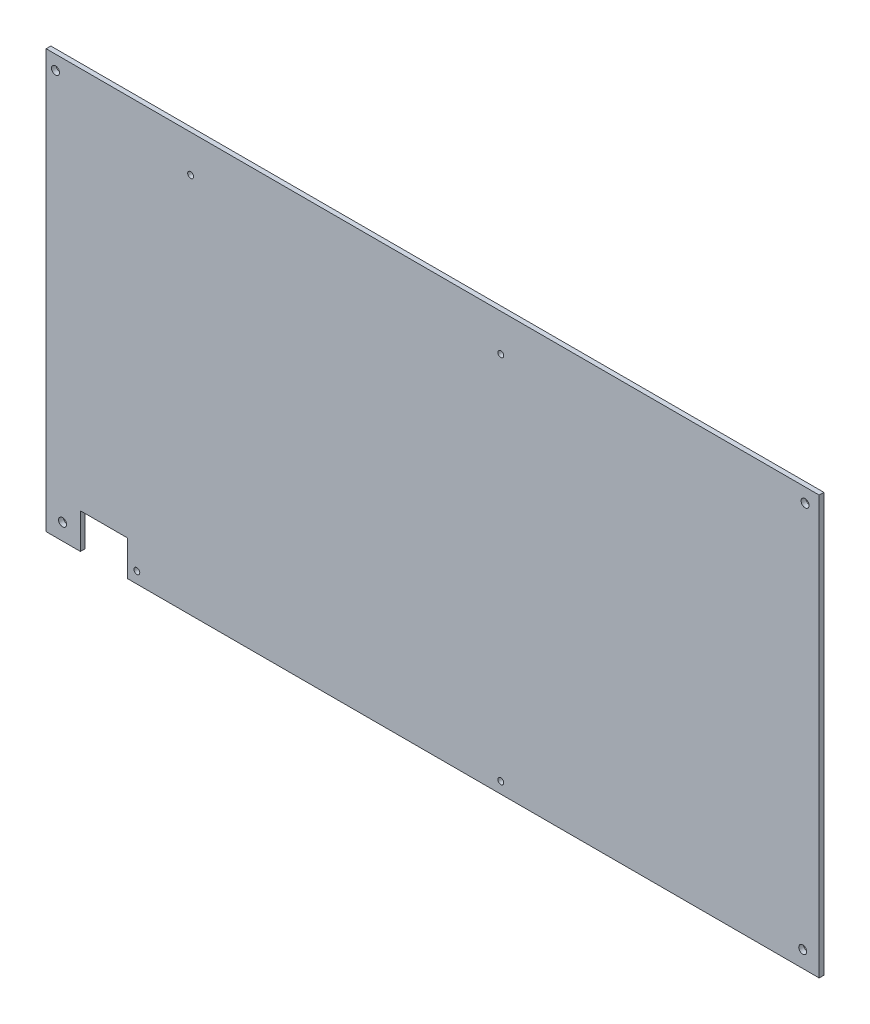
ISO-10303-21;
HEADER;
FILE_DESCRIPTION(('STEP AP214'),'2;1');
FILE_NAME('part.step','',(''),(''),'','','');
FILE_SCHEMA(('AUTOMOTIVE_DESIGN { 1 0 10303 214 1 1 1 1 }'));
ENDSEC;
DATA;
#1=APPLICATION_CONTEXT('core data for automotive mechanical design processes');
#2=APPLICATION_PROTOCOL_DEFINITION('international standard','automotive_design',2000,#1);
#3=PRODUCT_CONTEXT('',#1,'mechanical');
#4=PRODUCT('Part','Part','',(#3));
#5=PRODUCT_RELATED_PRODUCT_CATEGORY('part','',(#4));
#6=PRODUCT_DEFINITION_FORMATION('','',#4);
#7=PRODUCT_DEFINITION_CONTEXT('part definition',#1,'design');
#8=PRODUCT_DEFINITION('design','',#6,#7);
#9=PRODUCT_DEFINITION_SHAPE('','',#8);
#10=(LENGTH_UNIT() NAMED_UNIT(*) SI_UNIT(.MILLI.,.METRE.));
#11=(NAMED_UNIT(*) PLANE_ANGLE_UNIT() SI_UNIT($,.RADIAN.));
#12=(NAMED_UNIT(*) SI_UNIT($,.STERADIAN.) SOLID_ANGLE_UNIT());
#13=UNCERTAINTY_MEASURE_WITH_UNIT(LENGTH_MEASURE(1.E-05),#10,'distance_accuracy_value','');
#14=(GEOMETRIC_REPRESENTATION_CONTEXT(3) GLOBAL_UNCERTAINTY_ASSIGNED_CONTEXT((#13)) GLOBAL_UNIT_ASSIGNED_CONTEXT((#10,
#11,#12)) REPRESENTATION_CONTEXT('',''));
#15=CARTESIAN_POINT('',(0.,0.,0.));
#16=DIRECTION('',(0.,0.,1.));
#17=DIRECTION('',(1.,0.,0.));
#18=AXIS2_PLACEMENT_3D('',#15,#16,#17);
#19=CARTESIAN_POINT('',(0.,0.,-2.));
#20=DIRECTION('',(0.,-1.,0.));
#21=DIRECTION('',(0.,0.,-1.));
#22=AXIS2_PLACEMENT_3D('',#19,#20,#21);
#23=PLANE('',#22);
#24=DIRECTION('',(0.,0.,1.));
#25=VECTOR('',#24,1.);
#26=CARTESIAN_POINT('',(14.6,0.,-10.));
#27=LINE('',#26,#25);
#28=CARTESIAN_POINT('',(14.6,0.,-2.));
#29=VERTEX_POINT('',#28);
#30=CARTESIAN_POINT('',(14.6,0.,0.));
#31=VERTEX_POINT('',#30);
#32=EDGE_CURVE('E113',#29,#31,#27,.T.);
#33=ORIENTED_EDGE('',*,*,#32,.T.);
#34=DIRECTION('',(1.,0.,0.));
#35=VECTOR('',#34,1.);
#36=CARTESIAN_POINT('',(0.,0.,0.));
#37=LINE('',#36,#35);
#38=CARTESIAN_POINT('',(0.,0.,0.));
#39=VERTEX_POINT('',#38);
#40=EDGE_CURVE('E123',#39,#31,#37,.T.);
#41=ORIENTED_EDGE('',*,*,#40,.F.);
#42=DIRECTION('',(0.,0.,1.));
#43=VECTOR('',#42,1.);
#44=CARTESIAN_POINT('',(0.,0.,-2.));
#45=LINE('',#44,#43);
#46=CARTESIAN_POINT('',(0.,0.,-2.));
#47=VERTEX_POINT('',#46);
#48=EDGE_CURVE('E88',#47,#39,#45,.T.);
#49=ORIENTED_EDGE('',*,*,#48,.F.);
#50=DIRECTION('',(1.,0.,0.));
#51=VECTOR('',#50,1.);
#52=CARTESIAN_POINT('',(0.,0.,-2.));
#53=LINE('',#52,#51);
#54=EDGE_CURVE('E125',#47,#29,#53,.T.);
#55=ORIENTED_EDGE('',*,*,#54,.T.);
#56=EDGE_LOOP('',(#33,#41,#49,#55));
#57=FACE_BOUND('',#56,.T.);
#58=ADVANCED_FACE('F38',(#57),#23,.T.);
#59=CARTESIAN_POINT('',(0.,0.,0.));
#60=DIRECTION('',(0.,0.,-1.));
#61=DIRECTION('',(-1.,0.,0.));
#62=AXIS2_PLACEMENT_3D('',#59,#60,#61);
#63=PLANE('',#62);
#64=CARTESIAN_POINT('',(7.,7.00000000000001,0.));
#65=DIRECTION('',(0.,0.,1.));
#66=DIRECTION('',(1.,0.,0.));
#67=AXIS2_PLACEMENT_3D('',#64,#65,#66);
#68=CIRCLE('',#67,1.69999999999999);
#69=CARTESIAN_POINT('',(8.69999999999999,7.00000000000001,0.));
#70=VERTEX_POINT('',#69);
#71=EDGE_CURVE('E204',#70,#70,#68,.T.);
#72=ORIENTED_EDGE('',*,*,#71,.F.);
#73=EDGE_LOOP('',(#72));
#74=FACE_BOUND('',#73,.T.);
#75=CARTESIAN_POINT('',(4.,172.,0.));
#76=DIRECTION('',(0.,0.,1.));
#77=DIRECTION('',(1.,0.,0.));
#78=AXIS2_PLACEMENT_3D('',#75,#76,#77);
#79=CIRCLE('',#78,1.69999999999999);
#80=CARTESIAN_POINT('',(5.69999999999999,172.,0.));
#81=VERTEX_POINT('',#80);
#82=EDGE_CURVE('E210',#81,#81,#79,.T.);
#83=ORIENTED_EDGE('',*,*,#82,.F.);
#84=EDGE_LOOP('',(#83));
#85=FACE_BOUND('',#84,.T.);
#86=ORIENTED_EDGE('',*,*,#40,.T.);
#87=DIRECTION('',(0.,-1.,0.));
#88=VECTOR('',#87,1.);
#89=CARTESIAN_POINT('',(14.6,15.,0.));
#90=LINE('',#89,#88);
#91=CARTESIAN_POINT('',(14.6,15.,0.));
#92=VERTEX_POINT('',#91);
#93=EDGE_CURVE('E110',#92,#31,#90,.T.);
#94=ORIENTED_EDGE('',*,*,#93,.F.);
#95=DIRECTION('',(-1.,0.,0.));
#96=VECTOR('',#95,1.);
#97=CARTESIAN_POINT('',(14.6,15.,0.));
#98=LINE('',#97,#96);
#99=CARTESIAN_POINT('',(34.6,15.,0.));
#100=VERTEX_POINT('',#99);
#101=EDGE_CURVE('E127',#100,#92,#98,.T.);
#102=ORIENTED_EDGE('',*,*,#101,.F.);
#103=DIRECTION('',(0.,1.,0.));
#104=VECTOR('',#103,1.);
#105=CARTESIAN_POINT('',(34.6,15.,0.));
#106=LINE('',#105,#104);
#107=CARTESIAN_POINT('',(34.6,0.,0.));
#108=VERTEX_POINT('',#107);
#109=EDGE_CURVE('E121',#108,#100,#106,.T.);
#110=ORIENTED_EDGE('',*,*,#109,.F.);
#111=CARTESIAN_POINT('',(329.,0.,0.));
#112=VERTEX_POINT('',#111);
#113=EDGE_CURVE('E134',#108,#112,#37,.T.);
#114=ORIENTED_EDGE('',*,*,#113,.T.);
#115=DIRECTION('',(0.,1.,0.));
#116=VECTOR('',#115,1.);
#117=CARTESIAN_POINT('',(329.,0.,0.));
#118=LINE('',#117,#116);
#119=CARTESIAN_POINT('',(329.,178.,0.));
#120=VERTEX_POINT('',#119);
#121=EDGE_CURVE('E133',#112,#120,#118,.T.);
#122=ORIENTED_EDGE('',*,*,#121,.T.);
#123=DIRECTION('',(-1.,0.,0.));
#124=VECTOR('',#123,1.);
#125=CARTESIAN_POINT('',(0.,178.,0.));
#126=LINE('',#125,#124);
#127=CARTESIAN_POINT('',(0.,178.,0.));
#128=VERTEX_POINT('',#127);
#129=EDGE_CURVE('E137',#120,#128,#126,.T.);
#130=ORIENTED_EDGE('',*,*,#129,.T.);
#131=DIRECTION('',(0.,-1.,0.));
#132=VECTOR('',#131,1.);
#133=CARTESIAN_POINT('',(0.,0.,0.));
#134=LINE('',#133,#132);
#135=EDGE_CURVE('E132',#128,#39,#134,.T.);
#136=ORIENTED_EDGE('',*,*,#135,.T.);
#137=EDGE_LOOP('',(#86,#94,#102,#110,#114,#122,#130,#136));
#138=FACE_BOUND('',#137,.T.);
#139=CARTESIAN_POINT('',(323.,172.,0.));
#140=DIRECTION('',(0.,0.,1.));
#141=DIRECTION('',(1.,0.,0.));
#142=AXIS2_PLACEMENT_3D('',#139,#140,#141);
#143=CIRCLE('',#142,1.69999999999998);
#144=CARTESIAN_POINT('',(324.7,172.,0.));
#145=VERTEX_POINT('',#144);
#146=EDGE_CURVE('E216',#145,#145,#143,.T.);
#147=ORIENTED_EDGE('',*,*,#146,.F.);
#148=EDGE_LOOP('',(#147));
#149=FACE_BOUND('',#148,.T.);
#150=CARTESIAN_POINT('',(322.,7.00000000000002,0.));
#151=DIRECTION('',(0.,0.,1.));
#152=DIRECTION('',(1.,0.,0.));
#153=AXIS2_PLACEMENT_3D('',#150,#151,#152);
#154=CIRCLE('',#153,1.69999999999998);
#155=CARTESIAN_POINT('',(323.7,7.00000000000002,0.));
#156=VERTEX_POINT('',#155);
#157=EDGE_CURVE('E198',#156,#156,#154,.T.);
#158=ORIENTED_EDGE('',*,*,#157,.F.);
#159=EDGE_LOOP('',(#158));
#160=FACE_BOUND('',#159,.T.);
#161=CARTESIAN_POINT('',(38.6,4.79999999999999,0.));
#162=DIRECTION('',(0.,0.,1.));
#163=DIRECTION('',(1.,0.,0.));
#164=AXIS2_PLACEMENT_3D('',#161,#162,#163);
#165=CIRCLE('',#164,1.24999999999999);
#166=CARTESIAN_POINT('',(39.85,4.79999999999999,0.));
#167=VERTEX_POINT('',#166);
#168=EDGE_CURVE('E192',#167,#167,#165,.T.);
#169=ORIENTED_EDGE('',*,*,#168,.F.);
#170=EDGE_LOOP('',(#169));
#171=FACE_BOUND('',#170,.T.);
#172=CARTESIAN_POINT('',(193.5,4.79999999999999,0.));
#173=DIRECTION('',(0.,0.,1.));
#174=DIRECTION('',(1.,0.,0.));
#175=AXIS2_PLACEMENT_3D('',#172,#173,#174);
#176=CIRCLE('',#175,1.24999999999997);
#177=CARTESIAN_POINT('',(194.75,4.79999999999999,0.));
#178=VERTEX_POINT('',#177);
#179=EDGE_CURVE('E186',#178,#178,#176,.T.);
#180=ORIENTED_EDGE('',*,*,#179,.F.);
#181=EDGE_LOOP('',(#180));
#182=FACE_BOUND('',#181,.T.);
#183=CARTESIAN_POINT('',(193.5,162.2,0.));
#184=DIRECTION('',(0.,0.,1.));
#185=DIRECTION('',(1.,0.,0.));
#186=AXIS2_PLACEMENT_3D('',#183,#184,#185);
#187=CIRCLE('',#186,1.24999999999997);
#188=CARTESIAN_POINT('',(194.75,162.2,0.));
#189=VERTEX_POINT('',#188);
#190=EDGE_CURVE('E180',#189,#189,#187,.T.);
#191=ORIENTED_EDGE('',*,*,#190,.F.);
#192=EDGE_LOOP('',(#191));
#193=FACE_BOUND('',#192,.T.);
#194=CARTESIAN_POINT('',(61.5,162.2,0.));
#195=DIRECTION('',(0.,0.,1.));
#196=DIRECTION('',(1.,0.,0.));
#197=AXIS2_PLACEMENT_3D('',#194,#195,#196);
#198=CIRCLE('',#197,1.24999999999999);
#199=CARTESIAN_POINT('',(62.75,162.2,0.));
#200=VERTEX_POINT('',#199);
#201=EDGE_CURVE('E174',#200,#200,#198,.T.);
#202=ORIENTED_EDGE('',*,*,#201,.F.);
#203=EDGE_LOOP('',(#202));
#204=FACE_BOUND('',#203,.T.);
#205=ADVANCED_FACE('F129',(#74,#85,#138,#149,#160,#171,#182,#193,#204),#63,.F.);
#206=CARTESIAN_POINT('',(0.,0.,-2.));
#207=DIRECTION('',(-1.,0.,0.));
#208=DIRECTION('',(0.,0.,1.));
#209=AXIS2_PLACEMENT_3D('',#206,#207,#208);
#210=PLANE('',#209);
#211=ORIENTED_EDGE('',*,*,#135,.F.);
#212=DIRECTION('',(0.,0.,1.));
#213=VECTOR('',#212,1.);
#214=CARTESIAN_POINT('',(0.,178.,-2.));
#215=LINE('',#214,#213);
#216=CARTESIAN_POINT('',(0.,178.,-2.));
#217=VERTEX_POINT('',#216);
#218=EDGE_CURVE('E62',#217,#128,#215,.T.);
#219=ORIENTED_EDGE('',*,*,#218,.F.);
#220=DIRECTION('',(0.,-1.,0.));
#221=VECTOR('',#220,1.);
#222=CARTESIAN_POINT('',(0.,0.,-2.));
#223=LINE('',#222,#221);
#224=EDGE_CURVE('E143',#217,#47,#223,.T.);
#225=ORIENTED_EDGE('',*,*,#224,.T.);
#226=ORIENTED_EDGE('',*,*,#48,.T.);
#227=EDGE_LOOP('',(#211,#219,#225,#226));
#228=FACE_BOUND('',#227,.T.);
#229=ADVANCED_FACE('F40',(#228),#210,.T.);
#230=CARTESIAN_POINT('',(0.,178.,-2.));
#231=DIRECTION('',(0.,1.,0.));
#232=DIRECTION('',(0.,0.,1.));
#233=AXIS2_PLACEMENT_3D('',#230,#231,#232);
#234=PLANE('',#233);
#235=ORIENTED_EDGE('',*,*,#129,.F.);
#236=DIRECTION('',(0.,0.,1.));
#237=VECTOR('',#236,1.);
#238=CARTESIAN_POINT('',(329.,178.,-2.));
#239=LINE('',#238,#237);
#240=CARTESIAN_POINT('',(329.,178.,-2.));
#241=VERTEX_POINT('',#240);
#242=EDGE_CURVE('E146',#241,#120,#239,.T.);
#243=ORIENTED_EDGE('',*,*,#242,.F.);
#244=DIRECTION('',(-1.,0.,0.));
#245=VECTOR('',#244,1.);
#246=CARTESIAN_POINT('',(0.,178.,-2.));
#247=LINE('',#246,#245);
#248=EDGE_CURVE('E152',#241,#217,#247,.T.);
#249=ORIENTED_EDGE('',*,*,#248,.T.);
#250=ORIENTED_EDGE('',*,*,#218,.T.);
#251=EDGE_LOOP('',(#235,#243,#249,#250));
#252=FACE_BOUND('',#251,.T.);
#253=ADVANCED_FACE('F227',(#252),#234,.T.);
#254=CARTESIAN_POINT('',(329.,0.,-2.));
#255=DIRECTION('',(1.,0.,0.));
#256=DIRECTION('',(0.,0.,-1.));
#257=AXIS2_PLACEMENT_3D('',#254,#255,#256);
#258=PLANE('',#257);
#259=ORIENTED_EDGE('',*,*,#121,.F.);
#260=DIRECTION('',(0.,0.,1.));
#261=VECTOR('',#260,1.);
#262=CARTESIAN_POINT('',(329.,0.,-2.));
#263=LINE('',#262,#261);
#264=CARTESIAN_POINT('',(329.,0.,-2.));
#265=VERTEX_POINT('',#264);
#266=EDGE_CURVE('E148',#265,#112,#263,.T.);
#267=ORIENTED_EDGE('',*,*,#266,.F.);
#268=DIRECTION('',(0.,1.,0.));
#269=VECTOR('',#268,1.);
#270=CARTESIAN_POINT('',(329.,0.,-2.));
#271=LINE('',#270,#269);
#272=EDGE_CURVE('E224',#265,#241,#271,.T.);
#273=ORIENTED_EDGE('',*,*,#272,.T.);
#274=ORIENTED_EDGE('',*,*,#242,.T.);
#275=EDGE_LOOP('',(#259,#267,#273,#274));
#276=FACE_BOUND('',#275,.T.);
#277=ADVANCED_FACE('F230',(#276),#258,.T.);
#278=DIRECTION('',(0.,0.,1.));
#279=VECTOR('',#278,1.);
#280=CARTESIAN_POINT('',(34.6,0.,-10.));
#281=LINE('',#280,#279);
#282=CARTESIAN_POINT('',(34.6,0.,-2.));
#283=VERTEX_POINT('',#282);
#284=EDGE_CURVE('E126',#283,#108,#281,.T.);
#285=ORIENTED_EDGE('',*,*,#284,.F.);
#286=EDGE_CURVE('E162',#283,#265,#53,.T.);
#287=ORIENTED_EDGE('',*,*,#286,.T.);
#288=ORIENTED_EDGE('',*,*,#266,.T.);
#289=ORIENTED_EDGE('',*,*,#113,.F.);
#290=EDGE_LOOP('',(#285,#287,#288,#289));
#291=FACE_BOUND('',#290,.T.);
#292=ADVANCED_FACE('F168',(#291),#23,.T.);
#293=CARTESIAN_POINT('',(0.,0.,-2.));
#294=DIRECTION('',(0.,0.,-1.));
#295=DIRECTION('',(-1.,0.,0.));
#296=AXIS2_PLACEMENT_3D('',#293,#294,#295);
#297=PLANE('',#296);
#298=DIRECTION('',(0.,1.,0.));
#299=VECTOR('',#298,1.);
#300=CARTESIAN_POINT('',(14.6,0.,-2.));
#301=LINE('',#300,#299);
#302=CARTESIAN_POINT('',(14.6,15.,-2.));
#303=VERTEX_POINT('',#302);
#304=EDGE_CURVE('E11',#29,#303,#301,.T.);
#305=ORIENTED_EDGE('',*,*,#304,.F.);
#306=ORIENTED_EDGE('',*,*,#54,.F.);
#307=ORIENTED_EDGE('',*,*,#224,.F.);
#308=ORIENTED_EDGE('',*,*,#248,.F.);
#309=ORIENTED_EDGE('',*,*,#272,.F.);
#310=ORIENTED_EDGE('',*,*,#286,.F.);
#311=DIRECTION('',(0.,-1.,0.));
#312=VECTOR('',#311,1.);
#313=CARTESIAN_POINT('',(34.6,0.,-2.));
#314=LINE('',#313,#312);
#315=CARTESIAN_POINT('',(34.6,15.,-2.));
#316=VERTEX_POINT('',#315);
#317=EDGE_CURVE('E145',#316,#283,#314,.T.);
#318=ORIENTED_EDGE('',*,*,#317,.F.);
#319=DIRECTION('',(1.,0.,0.));
#320=VECTOR('',#319,1.);
#321=CARTESIAN_POINT('',(0.,15.,-2.));
#322=LINE('',#321,#320);
#323=EDGE_CURVE('E46',#303,#316,#322,.T.);
#324=ORIENTED_EDGE('',*,*,#323,.F.);
#325=EDGE_LOOP('',(#305,#306,#307,#308,#309,#310,#318,#324));
#326=FACE_BOUND('',#325,.T.);
#327=CARTESIAN_POINT('',(61.5,162.2,-2.));
#328=DIRECTION('',(0.,0.,-1.));
#329=DIRECTION('',(-1.,0.,0.));
#330=AXIS2_PLACEMENT_3D('',#327,#328,#329);
#331=CIRCLE('',#330,1.24999999999999);
#332=CARTESIAN_POINT('',(60.25,162.2,-2.));
#333=VERTEX_POINT('',#332);
#334=EDGE_CURVE('E177',#333,#333,#331,.T.);
#335=ORIENTED_EDGE('',*,*,#334,.F.);
#336=EDGE_LOOP('',(#335));
#337=FACE_BOUND('',#336,.T.);
#338=CARTESIAN_POINT('',(193.5,162.2,-2.));
#339=DIRECTION('',(0.,0.,-1.));
#340=DIRECTION('',(-1.,0.,0.));
#341=AXIS2_PLACEMENT_3D('',#338,#339,#340);
#342=CIRCLE('',#341,1.24999999999999);
#343=CARTESIAN_POINT('',(192.25,162.2,-2.));
#344=VERTEX_POINT('',#343);
#345=EDGE_CURVE('E183',#344,#344,#342,.T.);
#346=ORIENTED_EDGE('',*,*,#345,.F.);
#347=EDGE_LOOP('',(#346));
#348=FACE_BOUND('',#347,.T.);
#349=CARTESIAN_POINT('',(193.5,4.79999999999999,-2.));
#350=DIRECTION('',(0.,0.,-1.));
#351=DIRECTION('',(-1.,0.,0.));
#352=AXIS2_PLACEMENT_3D('',#349,#350,#351);
#353=CIRCLE('',#352,1.24999999999999);
#354=CARTESIAN_POINT('',(192.25,4.79999999999999,-2.));
#355=VERTEX_POINT('',#354);
#356=EDGE_CURVE('E189',#355,#355,#353,.T.);
#357=ORIENTED_EDGE('',*,*,#356,.F.);
#358=EDGE_LOOP('',(#357));
#359=FACE_BOUND('',#358,.T.);
#360=CARTESIAN_POINT('',(38.6,4.79999999999999,-2.));
#361=DIRECTION('',(0.,0.,-1.));
#362=DIRECTION('',(-1.,0.,0.));
#363=AXIS2_PLACEMENT_3D('',#360,#361,#362);
#364=CIRCLE('',#363,1.24999999999999);
#365=CARTESIAN_POINT('',(37.35,4.79999999999999,-2.));
#366=VERTEX_POINT('',#365);
#367=EDGE_CURVE('E195',#366,#366,#364,.T.);
#368=ORIENTED_EDGE('',*,*,#367,.F.);
#369=EDGE_LOOP('',(#368));
#370=FACE_BOUND('',#369,.T.);
#371=CARTESIAN_POINT('',(322.,7.00000000000002,-2.));
#372=DIRECTION('',(0.,0.,-1.));
#373=DIRECTION('',(-1.,0.,0.));
#374=AXIS2_PLACEMENT_3D('',#371,#372,#373);
#375=CIRCLE('',#374,1.69999999999998);
#376=CARTESIAN_POINT('',(320.3,7.00000000000002,-2.));
#377=VERTEX_POINT('',#376);
#378=EDGE_CURVE('E201',#377,#377,#375,.T.);
#379=ORIENTED_EDGE('',*,*,#378,.F.);
#380=EDGE_LOOP('',(#379));
#381=FACE_BOUND('',#380,.T.);
#382=CARTESIAN_POINT('',(7.,7.00000000000001,-2.));
#383=DIRECTION('',(0.,0.,-1.));
#384=DIRECTION('',(-1.,0.,0.));
#385=AXIS2_PLACEMENT_3D('',#382,#383,#384);
#386=CIRCLE('',#385,1.69999999999999);
#387=CARTESIAN_POINT('',(5.30000000000001,7.00000000000001,-2.));
#388=VERTEX_POINT('',#387);
#389=EDGE_CURVE('E207',#388,#388,#386,.T.);
#390=ORIENTED_EDGE('',*,*,#389,.F.);
#391=EDGE_LOOP('',(#390));
#392=FACE_BOUND('',#391,.T.);
#393=CARTESIAN_POINT('',(4.,172.,-2.));
#394=DIRECTION('',(0.,0.,-1.));
#395=DIRECTION('',(-1.,0.,0.));
#396=AXIS2_PLACEMENT_3D('',#393,#394,#395);
#397=CIRCLE('',#396,1.69999999999999);
#398=CARTESIAN_POINT('',(2.30000000000001,172.,-2.));
#399=VERTEX_POINT('',#398);
#400=EDGE_CURVE('E213',#399,#399,#397,.T.);
#401=ORIENTED_EDGE('',*,*,#400,.F.);
#402=EDGE_LOOP('',(#401));
#403=FACE_BOUND('',#402,.T.);
#404=CARTESIAN_POINT('',(323.,172.,-2.));
#405=DIRECTION('',(0.,0.,-1.));
#406=DIRECTION('',(-1.,0.,0.));
#407=AXIS2_PLACEMENT_3D('',#404,#405,#406);
#408=CIRCLE('',#407,1.69999999999998);
#409=CARTESIAN_POINT('',(321.3,172.,-2.));
#410=VERTEX_POINT('',#409);
#411=EDGE_CURVE('E219',#410,#410,#408,.T.);
#412=ORIENTED_EDGE('',*,*,#411,.F.);
#413=EDGE_LOOP('',(#412));
#414=FACE_BOUND('',#413,.T.);
#415=ADVANCED_FACE('F159',(#326,#337,#348,#359,#370,#381,#392,#403,#414),#297,.T.);
#416=CARTESIAN_POINT('',(323.,172.,0.));
#417=DIRECTION('',(0.,0.,1.));
#418=DIRECTION('',(1.,0.,0.));
#419=AXIS2_PLACEMENT_3D('',#416,#417,#418);
#420=CYLINDRICAL_SURFACE('',#419,1.69999999999998);
#421=ORIENTED_EDGE('',*,*,#146,.T.);
#422=EDGE_LOOP('',(#421));
#423=FACE_BOUND('',#422,.T.);
#424=ORIENTED_EDGE('',*,*,#411,.T.);
#425=EDGE_LOOP('',(#424));
#426=FACE_BOUND('',#425,.T.);
#427=ADVANCED_FACE('F252',(#423,#426),#420,.F.);
#428=CARTESIAN_POINT('',(4.,172.,0.));
#429=DIRECTION('',(0.,0.,1.));
#430=DIRECTION('',(1.,0.,0.));
#431=AXIS2_PLACEMENT_3D('',#428,#429,#430);
#432=CYLINDRICAL_SURFACE('',#431,1.69999999999999);
#433=ORIENTED_EDGE('',*,*,#82,.T.);
#434=EDGE_LOOP('',(#433));
#435=FACE_BOUND('',#434,.T.);
#436=ORIENTED_EDGE('',*,*,#400,.T.);
#437=EDGE_LOOP('',(#436));
#438=FACE_BOUND('',#437,.T.);
#439=ADVANCED_FACE('F255',(#435,#438),#432,.F.);
#440=CARTESIAN_POINT('',(7.,7.00000000000001,0.));
#441=DIRECTION('',(0.,0.,1.));
#442=DIRECTION('',(1.,0.,0.));
#443=AXIS2_PLACEMENT_3D('',#440,#441,#442);
#444=CYLINDRICAL_SURFACE('',#443,1.69999999999999);
#445=ORIENTED_EDGE('',*,*,#71,.T.);
#446=EDGE_LOOP('',(#445));
#447=FACE_BOUND('',#446,.T.);
#448=ORIENTED_EDGE('',*,*,#389,.T.);
#449=EDGE_LOOP('',(#448));
#450=FACE_BOUND('',#449,.T.);
#451=ADVANCED_FACE('F259',(#447,#450),#444,.F.);
#452=CARTESIAN_POINT('',(322.,7.00000000000002,0.));
#453=DIRECTION('',(0.,0.,1.));
#454=DIRECTION('',(1.,0.,0.));
#455=AXIS2_PLACEMENT_3D('',#452,#453,#454);
#456=CYLINDRICAL_SURFACE('',#455,1.69999999999998);
#457=ORIENTED_EDGE('',*,*,#157,.T.);
#458=EDGE_LOOP('',(#457));
#459=FACE_BOUND('',#458,.T.);
#460=ORIENTED_EDGE('',*,*,#378,.T.);
#461=EDGE_LOOP('',(#460));
#462=FACE_BOUND('',#461,.T.);
#463=ADVANCED_FACE('F263',(#459,#462),#456,.F.);
#464=CARTESIAN_POINT('',(38.6,4.79999999999999,0.));
#465=DIRECTION('',(0.,0.,1.));
#466=DIRECTION('',(1.,0.,0.));
#467=AXIS2_PLACEMENT_3D('',#464,#465,#466);
#468=CYLINDRICAL_SURFACE('',#467,1.24999999999999);
#469=ORIENTED_EDGE('',*,*,#168,.T.);
#470=EDGE_LOOP('',(#469));
#471=FACE_BOUND('',#470,.T.);
#472=ORIENTED_EDGE('',*,*,#367,.T.);
#473=EDGE_LOOP('',(#472));
#474=FACE_BOUND('',#473,.T.);
#475=ADVANCED_FACE('F267',(#471,#474),#468,.F.);
#476=CARTESIAN_POINT('',(193.5,4.79999999999999,0.));
#477=DIRECTION('',(0.,0.,1.));
#478=DIRECTION('',(1.,0.,0.));
#479=AXIS2_PLACEMENT_3D('',#476,#477,#478);
#480=CYLINDRICAL_SURFACE('',#479,1.24999999999999);
#481=ORIENTED_EDGE('',*,*,#179,.T.);
#482=EDGE_LOOP('',(#481));
#483=FACE_BOUND('',#482,.T.);
#484=ORIENTED_EDGE('',*,*,#356,.T.);
#485=EDGE_LOOP('',(#484));
#486=FACE_BOUND('',#485,.T.);
#487=ADVANCED_FACE('F271',(#483,#486),#480,.F.);
#488=CARTESIAN_POINT('',(193.5,162.2,0.));
#489=DIRECTION('',(0.,0.,1.));
#490=DIRECTION('',(1.,0.,0.));
#491=AXIS2_PLACEMENT_3D('',#488,#489,#490);
#492=CYLINDRICAL_SURFACE('',#491,1.24999999999999);
#493=ORIENTED_EDGE('',*,*,#190,.T.);
#494=EDGE_LOOP('',(#493));
#495=FACE_BOUND('',#494,.T.);
#496=ORIENTED_EDGE('',*,*,#345,.T.);
#497=EDGE_LOOP('',(#496));
#498=FACE_BOUND('',#497,.T.);
#499=ADVANCED_FACE('F275',(#495,#498),#492,.F.);
#500=CARTESIAN_POINT('',(61.5,162.2,0.));
#501=DIRECTION('',(0.,0.,1.));
#502=DIRECTION('',(1.,0.,0.));
#503=AXIS2_PLACEMENT_3D('',#500,#501,#502);
#504=CYLINDRICAL_SURFACE('',#503,1.24999999999999);
#505=ORIENTED_EDGE('',*,*,#201,.T.);
#506=EDGE_LOOP('',(#505));
#507=FACE_BOUND('',#506,.T.);
#508=ORIENTED_EDGE('',*,*,#334,.T.);
#509=EDGE_LOOP('',(#508));
#510=FACE_BOUND('',#509,.T.);
#511=ADVANCED_FACE('F279',(#507,#510),#504,.F.);
#512=CARTESIAN_POINT('',(14.6,15.,-10.));
#513=DIRECTION('',(-1.,0.,0.));
#514=DIRECTION('',(0.,-1.,0.));
#515=AXIS2_PLACEMENT_3D('',#512,#513,#514);
#516=PLANE('',#515);
#517=ORIENTED_EDGE('',*,*,#304,.T.);
#518=DIRECTION('',(0.,0.,1.));
#519=VECTOR('',#518,1.);
#520=CARTESIAN_POINT('',(14.6,15.,-10.));
#521=LINE('',#520,#519);
#522=EDGE_CURVE('E116',#303,#92,#521,.T.);
#523=ORIENTED_EDGE('',*,*,#522,.T.);
#524=ORIENTED_EDGE('',*,*,#93,.T.);
#525=ORIENTED_EDGE('',*,*,#32,.F.);
#526=EDGE_LOOP('',(#517,#523,#524,#525));
#527=FACE_BOUND('',#526,.T.);
#528=ADVANCED_FACE('F112',(#527),#516,.F.);
#529=CARTESIAN_POINT('',(14.6,15.,-10.));
#530=DIRECTION('',(0.,1.,0.));
#531=DIRECTION('',(0.,0.,1.));
#532=AXIS2_PLACEMENT_3D('',#529,#530,#531);
#533=PLANE('',#532);
#534=ORIENTED_EDGE('',*,*,#323,.T.);
#535=DIRECTION('',(0.,0.,1.));
#536=VECTOR('',#535,1.);
#537=CARTESIAN_POINT('',(34.6,15.,-10.));
#538=LINE('',#537,#536);
#539=EDGE_CURVE('E53',#316,#100,#538,.T.);
#540=ORIENTED_EDGE('',*,*,#539,.T.);
#541=ORIENTED_EDGE('',*,*,#101,.T.);
#542=ORIENTED_EDGE('',*,*,#522,.F.);
#543=EDGE_LOOP('',(#534,#540,#541,#542));
#544=FACE_BOUND('',#543,.T.);
#545=ADVANCED_FACE('F156',(#544),#533,.F.);
#546=CARTESIAN_POINT('',(34.6,15.,-10.));
#547=DIRECTION('',(1.,0.,0.));
#548=DIRECTION('',(0.,0.,-1.));
#549=AXIS2_PLACEMENT_3D('',#546,#547,#548);
#550=PLANE('',#549);
#551=ORIENTED_EDGE('',*,*,#317,.T.);
#552=ORIENTED_EDGE('',*,*,#284,.T.);
#553=ORIENTED_EDGE('',*,*,#109,.T.);
#554=ORIENTED_EDGE('',*,*,#539,.F.);
#555=EDGE_LOOP('',(#551,#552,#553,#554));
#556=FACE_BOUND('',#555,.T.);
#557=ADVANCED_FACE('F164',(#556),#550,.F.);
#558=CLOSED_SHELL('',(#58,#205,#229,#253,#277,#292,#415,#427,#439,#451,#463,#475,#487,#499,#511,
#528,#545,#557));
#559=MANIFOLD_SOLID_BREP('B2',#558);
#560=ADVANCED_BREP_SHAPE_REPRESENTATION('',(#18,#559),#14);
#561=SHAPE_DEFINITION_REPRESENTATION(#9,#560);
ENDSEC;
END-ISO-10303-21;
